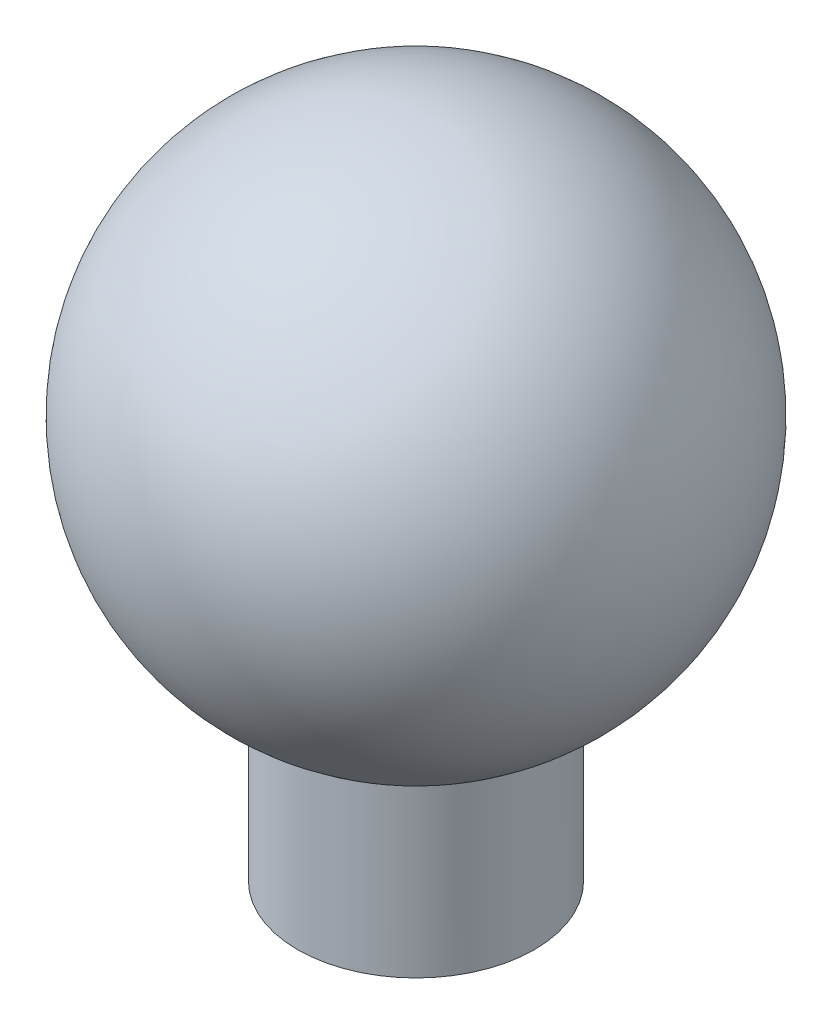
ISO-10303-21;
HEADER;
FILE_DESCRIPTION(('STEP AP214'),'2;1');
FILE_NAME('part.step','',(''),(''),'','','');
FILE_SCHEMA(('AUTOMOTIVE_DESIGN { 1 0 10303 214 1 1 1 1 }'));
ENDSEC;
DATA;
#1=APPLICATION_CONTEXT('core data for automotive mechanical design processes');
#2=APPLICATION_PROTOCOL_DEFINITION('international standard','automotive_design',2000,#1);
#3=PRODUCT_CONTEXT('',#1,'mechanical');
#4=PRODUCT('Part','Part','',(#3));
#5=PRODUCT_RELATED_PRODUCT_CATEGORY('part','',(#4));
#6=PRODUCT_DEFINITION_FORMATION('','',#4);
#7=PRODUCT_DEFINITION_CONTEXT('part definition',#1,'design');
#8=PRODUCT_DEFINITION('design','',#6,#7);
#9=PRODUCT_DEFINITION_SHAPE('','',#8);
#10=(LENGTH_UNIT() NAMED_UNIT(*) SI_UNIT(.MILLI.,.METRE.));
#11=(NAMED_UNIT(*) PLANE_ANGLE_UNIT() SI_UNIT($,.RADIAN.));
#12=(NAMED_UNIT(*) SI_UNIT($,.STERADIAN.) SOLID_ANGLE_UNIT());
#13=UNCERTAINTY_MEASURE_WITH_UNIT(LENGTH_MEASURE(1.E-05),#10,'distance_accuracy_value','');
#14=(GEOMETRIC_REPRESENTATION_CONTEXT(3) GLOBAL_UNCERTAINTY_ASSIGNED_CONTEXT((#13)) GLOBAL_UNIT_ASSIGNED_CONTEXT((#10,
#11,#12)) REPRESENTATION_CONTEXT('',''));
#15=CARTESIAN_POINT('',(0.,0.,0.));
#16=DIRECTION('',(0.,0.,1.));
#17=DIRECTION('',(1.,0.,0.));
#18=AXIS2_PLACEMENT_3D('',#15,#16,#17);
#19=CARTESIAN_POINT('',(0.,0.,0.));
#20=DIRECTION('',(0.,1.,0.));
#21=DIRECTION('',(-1.,0.,0.));
#22=AXIS2_PLACEMENT_3D('',#19,#20,#21);
#23=SPHERICAL_SURFACE('',#22,11.04);
#24=CARTESIAN_POINT('',(0.,-9.84284511713966,0.));
#25=DIRECTION('',(0.,1.,0.));
#26=DIRECTION('',(0.,0.,1.));
#27=AXIS2_PLACEMENT_3D('',#24,#25,#26);
#28=CIRCLE('',#27,5.);
#29=CARTESIAN_POINT('',(0.,-9.84284511713966,5.));
#30=VERTEX_POINT('',#29);
#31=EDGE_CURVE('E42',#30,#30,#28,.T.);
#32=ORIENTED_EDGE('',*,*,#31,.T.);
#33=EDGE_LOOP('',(#32));
#34=FACE_BOUND('',#33,.T.);
#35=ADVANCED_FACE('F32',(#34),#23,.T.);
#36=CARTESIAN_POINT('',(0.,-17.,0.));
#37=DIRECTION('',(0.,1.,0.));
#38=DIRECTION('',(0.,0.,1.));
#39=AXIS2_PLACEMENT_3D('',#36,#37,#38);
#40=CYLINDRICAL_SURFACE('',#39,5.);
#41=ORIENTED_EDGE('',*,*,#31,.F.);
#42=EDGE_LOOP('',(#41));
#43=FACE_BOUND('',#42,.T.);
#44=CARTESIAN_POINT('',(0.,-17.,0.));
#45=DIRECTION('',(0.,-1.,0.));
#46=DIRECTION('',(0.,0.,-1.));
#47=AXIS2_PLACEMENT_3D('',#44,#45,#46);
#48=CIRCLE('',#47,5.);
#49=CARTESIAN_POINT('',(0.,-17.,-5.));
#50=VERTEX_POINT('',#49);
#51=EDGE_CURVE('E46',#50,#50,#48,.T.);
#52=ORIENTED_EDGE('',*,*,#51,.F.);
#53=EDGE_LOOP('',(#52));
#54=FACE_BOUND('',#53,.T.);
#55=ADVANCED_FACE('F54',(#43,#54),#40,.T.);
#56=CARTESIAN_POINT('',(0.,-17.,0.));
#57=DIRECTION('',(0.,-1.,0.));
#58=DIRECTION('',(0.,0.,-1.));
#59=AXIS2_PLACEMENT_3D('',#56,#57,#58);
#60=PLANE('',#59);
#61=ORIENTED_EDGE('',*,*,#51,.T.);
#62=EDGE_LOOP('',(#61));
#63=FACE_BOUND('',#62,.T.);
#64=ADVANCED_FACE('F52',(#63),#60,.T.);
#65=CLOSED_SHELL('',(#35,#55,#64));
#66=CARTESIAN_POINT('',(0.,8.5,0.));
#67=DIRECTION('',(0.,1.,0.));
#68=DIRECTION('',(0.,0.,1.));
#69=AXIS2_PLACEMENT_3D('',#66,#67,#68);
#70=CYLINDRICAL_SURFACE('',#69,5.);
#71=CARTESIAN_POINT('',(0.,-6.87386354243376,0.));
#72=DIRECTION('',(0.,1.,0.));
#73=DIRECTION('',(0.,0.,1.));
#74=AXIS2_PLACEMENT_3D('',#71,#72,#73);
#75=CIRCLE('',#74,5.);
#76=CARTESIAN_POINT('',(-5.,-6.87386354243376,0.));
#77=VERTEX_POINT('',#76);
#78=EDGE_CURVE('E38',#77,#77,#75,.T.);
#79=ORIENTED_EDGE('',*,*,#78,.T.);
#80=EDGE_LOOP('',(#79));
#81=FACE_BOUND('',#80,.T.);
#82=CARTESIAN_POINT('',(0.,6.87386354243376,0.));
#83=DIRECTION('',(0.,1.,0.));
#84=DIRECTION('',(0.,0.,1.));
#85=AXIS2_PLACEMENT_3D('',#82,#83,#84);
#86=CIRCLE('',#85,5.);
#87=CARTESIAN_POINT('',(-5.,6.87386354243376,0.));
#88=VERTEX_POINT('',#87);
#89=EDGE_CURVE('E10',#88,#88,#86,.T.);
#90=ORIENTED_EDGE('',*,*,#89,.F.);
#91=EDGE_LOOP('',(#90));
#92=FACE_BOUND('',#91,.T.);
#93=ADVANCED_FACE('F68',(#81,#92),#70,.T.);
#94=CARTESIAN_POINT('',(0.,0.,0.));
#95=DIRECTION('',(0.,1.,0.));
#96=DIRECTION('',(-1.,0.,0.));
#97=AXIS2_PLACEMENT_3D('',#94,#95,#96);
#98=SPHERICAL_SURFACE('',#97,8.5);
#99=CARTESIAN_POINT('',(-5.,-6.87386354243376,0.));
#100=CARTESIAN_POINT('',(-5.13489218622134,-6.77575145786367,0.));
#101=CARTESIAN_POINT('',(-5.26688874699863,-6.67365960506768,0.));
#102=CARTESIAN_POINT('',(-5.5246503187593,-6.46189080563915,0.));
#103=CARTESIAN_POINT('',(-5.65041532974268,-6.3522138590066,0.));
#104=CARTESIAN_POINT('',(-5.89527350300974,-6.12564931452018,0.));
#105=CARTESIAN_POINT('',(-6.01436666529342,-6.00876171666631,0.));
#106=CARTESIAN_POINT('',(-6.24546974323991,-5.76818233669493,0.));
#107=CARTESIAN_POINT('',(-6.35747965890272,-5.64449055457742,0.));
#108=CARTESIAN_POINT('',(-6.5740278367961,-5.39073096058417,0.));
#109=CARTESIAN_POINT('',(-6.67856609902667,-5.26066314870843,0.));
#110=CARTESIAN_POINT('',(-6.87980886553332,-4.99460224621885,0.));
#111=CARTESIAN_POINT('',(-6.97651336980941,-4.85860915560503,0.));
#112=CARTESIAN_POINT('',(-7.16175354610609,-4.58116884042483,0.));
#113=CARTESIAN_POINT('',(-7.25028921812668,-4.43972161585845,0.));
#114=CARTESIAN_POINT('',(-7.41888498787448,-4.15186311072082,0.));
#115=CARTESIAN_POINT('',(-7.4989450856017,-4.00545183014958,0.));
#116=CARTESIAN_POINT('',(-7.65031232194142,-3.70817248012118,0.));
#117=CARTESIAN_POINT('',(-7.72161946055393,-3.55730441066403,0.));
#118=CARTESIAN_POINT('',(-7.85523372224251,-3.25163419396477,0.));
#119=CARTESIAN_POINT('',(-7.91754084531857,-3.09683204672267,0.));
#120=CARTESIAN_POINT('',(-8.03293920117032,-2.783830015202,0.));
#121=CARTESIAN_POINT('',(-8.08603043394601,-2.62563013092344,0.));
#122=CARTESIAN_POINT('',(-8.18281306475671,-2.30638073835881,0.));
#123=CARTESIAN_POINT('',(-8.22650446279174,-2.14533123007275,0.));
#124=CARTESIAN_POINT('',(-8.30433604711932,-1.82094057552549,0.));
#125=CARTESIAN_POINT('',(-8.33847623341189,-1.65759942926431,0.));
#126=CARTESIAN_POINT('',(-8.39708710921735,-1.32919142461959,0.));
#127=CARTESIAN_POINT('',(-8.42155779873025,-1.16412456623607,0.));
#128=CARTESIAN_POINT('',(-8.46074489771031,-0.832837042247185,0.));
#129=CARTESIAN_POINT('',(-8.47546130717747,-0.666616376641834,0.));
#130=CARTESIAN_POINT('',(-8.49508885832232,-0.333597140690989,0.));
#131=CARTESIAN_POINT('',(-8.5,-0.166798570345495,0.));
#132=CARTESIAN_POINT('',(-8.5,0.166798570345493,0.));
#133=CARTESIAN_POINT('',(-8.49508885832232,0.333597140690987,0.));
#134=CARTESIAN_POINT('',(-8.47546130717747,0.666616376641832,0.));
#135=CARTESIAN_POINT('',(-8.46074489771031,0.832837042247184,0.));
#136=CARTESIAN_POINT('',(-8.42155779873025,1.16412456623606,0.));
#137=CARTESIAN_POINT('',(-8.39708710921735,1.32919142461959,0.));
#138=CARTESIAN_POINT('',(-8.33847623341189,1.65759942926431,0.));
#139=CARTESIAN_POINT('',(-8.30433604711932,1.82094057552549,0.));
#140=CARTESIAN_POINT('',(-8.22650446279174,2.14533123007275,0.));
#141=CARTESIAN_POINT('',(-8.18281306475671,2.30638073835881,0.));
#142=CARTESIAN_POINT('',(-8.08603043394601,2.62563013092344,0.));
#143=CARTESIAN_POINT('',(-8.03293920117032,2.783830015202,0.));
#144=CARTESIAN_POINT('',(-7.91754084531857,3.09683204672267,0.));
#145=CARTESIAN_POINT('',(-7.85523372224251,3.25163419396477,0.));
#146=CARTESIAN_POINT('',(-7.72161946055394,3.55730441066403,0.));
#147=CARTESIAN_POINT('',(-7.65031232194142,3.70817248012118,0.));
#148=CARTESIAN_POINT('',(-7.4989450856017,4.00545183014958,0.));
#149=CARTESIAN_POINT('',(-7.41888498787448,4.15186311072082,0.));
#150=CARTESIAN_POINT('',(-7.25028921812668,4.43972161585845,0.));
#151=CARTESIAN_POINT('',(-7.16175354610609,4.58116884042483,0.));
#152=CARTESIAN_POINT('',(-6.97651336980941,4.85860915560503,0.));
#153=CARTESIAN_POINT('',(-6.87980886553332,4.99460224621885,0.));
#154=CARTESIAN_POINT('',(-6.67856609902667,5.26066314870842,0.));
#155=CARTESIAN_POINT('',(-6.5740278367961,5.39073096058417,0.));
#156=CARTESIAN_POINT('',(-6.35747965890272,5.64449055457742,0.));
#157=CARTESIAN_POINT('',(-6.24546974323991,5.76818233669493,0.));
#158=CARTESIAN_POINT('',(-6.01436666529342,6.00876171666631,0.));
#159=CARTESIAN_POINT('',(-5.89527350300975,6.12564931452018,0.));
#160=CARTESIAN_POINT('',(-5.65041532974269,6.3522138590066,0.));
#161=CARTESIAN_POINT('',(-5.5246503187593,6.46189080563915,0.));
#162=CARTESIAN_POINT('',(-5.26688874699863,6.67365960506768,0.));
#163=CARTESIAN_POINT('',(-5.13489218622134,6.77575145786367,0.));
#164=CARTESIAN_POINT('',(-5.,6.87386354243376,0.));
#165=B_SPLINE_CURVE_WITH_KNOTS('',3,(#99,#100,#101,#102,#103,#104,#105,#106,#107,#108,#109,#110,
#111,#112,#113,#114,#115,#116,#117,#118,#119,#120,#121,#122,#123,#124,#125,#126,#127,#128,#129,
#130,#131,#132,#133,#134,#135,#136,#137,#138,#139,#140,#141,#142,#143,#144,#145,#146,#147,#148,
#149,#150,#151,#152,#153,#154,#155,#156,#157,#158,#159,#160,#161,#162,#163,#164),.UNSPECIFIED.,
.F.,.F.,(4,2,2,2,2,2,2,2,2,2,2,2,2,2,2,2,2,2,2,2,2,2,2,2,2,2,2,2,2,2,2,2,4),(0.,
0.500323488606968,1.00064697721393,1.5009704658209,2.00129395442787,2.50161744303484,
3.0019409316418,3.50226442024877,4.00258790885574,4.5029113974627,5.00323488606967,
5.50355837467664,6.0038818632836,6.50420535189057,7.00452884049754,7.5048523291045,
8.00517581771147,8.50549930631844,9.00582279492541,9.50614628353237,10.0064697721393,
10.5067932607463,11.0071167493533,11.5074402379602,12.0077637265672,12.5080872151742,
13.0084107037811,13.5087341923881,14.0090576809951,14.509381169602,15.009704658209,
15.510028146816,16.0103516354229),.UNSPECIFIED.);
#166=EDGE_CURVE('BSEAM66',#77,#88,#165,.T.);
#167=ORIENTED_EDGE('',*,*,#78,.F.);
#168=ORIENTED_EDGE('',*,*,#89,.T.);
#169=ORIENTED_EDGE('',*,*,#166,.T.);
#170=ORIENTED_EDGE('',*,*,#166,.F.);
#171=EDGE_LOOP('',(#167,#169,#168,#170));
#172=FACE_BOUND('',#171,.T.);
#173=ADVANCED_FACE('F66',(#172),#98,.F.);
#174=CLOSED_SHELL('',(#93,#173));
#175=ORIENTED_CLOSED_SHELL('',*,#174,.T.);
#176=BREP_WITH_VOIDS('B2',#65,(#175));
#177=ADVANCED_BREP_SHAPE_REPRESENTATION('',(#18,#176),#14);
#178=SHAPE_DEFINITION_REPRESENTATION(#9,#177);
ENDSEC;
END-ISO-10303-21;
